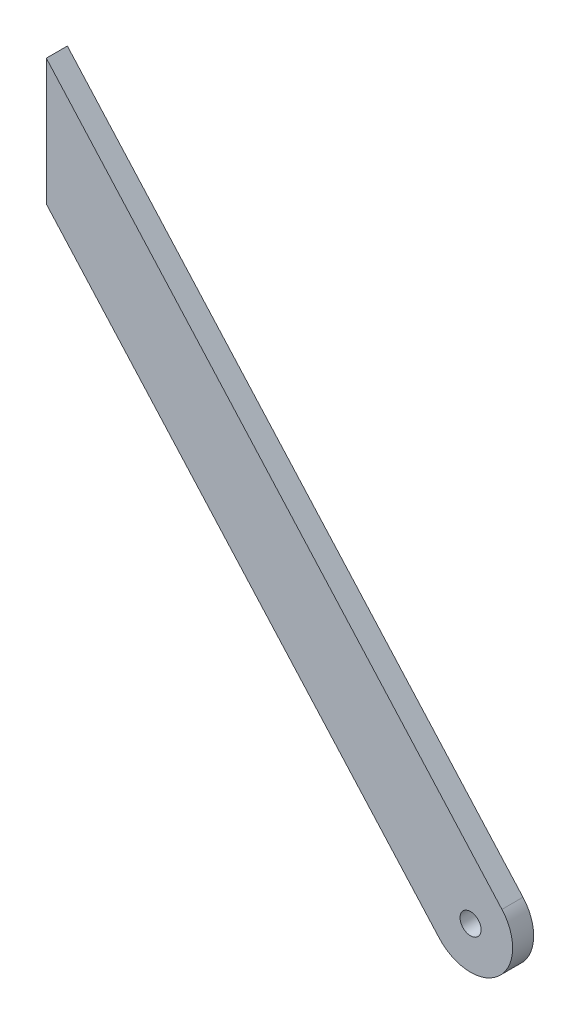
ISO-10303-21;
HEADER;
FILE_DESCRIPTION(('STEP AP214'),'2;1');
FILE_NAME('part.step','',(''),(''),'','','');
FILE_SCHEMA(('AUTOMOTIVE_DESIGN { 1 0 10303 214 1 1 1 1 }'));
ENDSEC;
DATA;
#1=APPLICATION_CONTEXT('core data for automotive mechanical design processes');
#2=APPLICATION_PROTOCOL_DEFINITION('international standard','automotive_design',2000,#1);
#3=PRODUCT_CONTEXT('',#1,'mechanical');
#4=PRODUCT('Part','Part','',(#3));
#5=PRODUCT_RELATED_PRODUCT_CATEGORY('part','',(#4));
#6=PRODUCT_DEFINITION_FORMATION('','',#4);
#7=PRODUCT_DEFINITION_CONTEXT('part definition',#1,'design');
#8=PRODUCT_DEFINITION('design','',#6,#7);
#9=PRODUCT_DEFINITION_SHAPE('','',#8);
#10=(LENGTH_UNIT() NAMED_UNIT(*) SI_UNIT(.MILLI.,.METRE.));
#11=(NAMED_UNIT(*) PLANE_ANGLE_UNIT() SI_UNIT($,.RADIAN.));
#12=(NAMED_UNIT(*) SI_UNIT($,.STERADIAN.) SOLID_ANGLE_UNIT());
#13=UNCERTAINTY_MEASURE_WITH_UNIT(LENGTH_MEASURE(1.E-05),#10,'distance_accuracy_value','');
#14=(GEOMETRIC_REPRESENTATION_CONTEXT(3) GLOBAL_UNCERTAINTY_ASSIGNED_CONTEXT((#13)) GLOBAL_UNIT_ASSIGNED_CONTEXT((#10,
#11,#12)) REPRESENTATION_CONTEXT('',''));
#15=CARTESIAN_POINT('',(0.,0.,0.));
#16=DIRECTION('',(0.,0.,1.));
#17=DIRECTION('',(1.,0.,0.));
#18=AXIS2_PLACEMENT_3D('',#15,#16,#17);
#19=CARTESIAN_POINT('',(201.573786516665,-195.366344566647,10.));
#20=DIRECTION('',(0.,0.,-1.));
#21=DIRECTION('',(-1.,0.,0.));
#22=AXIS2_PLACEMENT_3D('',#19,#20,#21);
#23=PLANE('',#22);
#24=DIRECTION('',(0.666666666666667,-0.74535599249993,0.));
#25=VECTOR('',#24,1.);
#26=CARTESIAN_POINT('',(186.666666666667,-208.69967789998,10.));
#27=LINE('',#26,#25);
#28=CARTESIAN_POINT('',(0.,0.,10.));
#29=VERTEX_POINT('',#28);
#30=CARTESIAN_POINT('',(186.666666666667,-208.69967789998,10.));
#31=VERTEX_POINT('',#30);
#32=EDGE_CURVE('E85',#29,#31,#27,.T.);
#33=ORIENTED_EDGE('',*,*,#32,.T.);
#34=CARTESIAN_POINT('',(201.573786516665,-195.366344566647,10.));
#35=DIRECTION('',(0.,0.,1.));
#36=DIRECTION('',(-1.,0.,0.));
#37=AXIS2_PLACEMENT_3D('',#34,#35,#36);
#38=CIRCLE('',#37,20.);
#39=CARTESIAN_POINT('',(216.480906366664,-182.033011233314,10.));
#40=VERTEX_POINT('',#39);
#41=EDGE_CURVE('E80',#31,#40,#38,.T.);
#42=ORIENTED_EDGE('',*,*,#41,.T.);
#43=DIRECTION('',(-0.666666666666667,0.74535599249993,0.));
#44=VECTOR('',#43,1.);
#45=CARTESIAN_POINT('',(0.,60.,10.));
#46=LINE('',#45,#44);
#47=CARTESIAN_POINT('',(0.,60.,10.));
#48=VERTEX_POINT('',#47);
#49=EDGE_CURVE('E83',#40,#48,#46,.T.);
#50=ORIENTED_EDGE('',*,*,#49,.T.);
#51=DIRECTION('',(0.,-1.,0.));
#52=VECTOR('',#51,1.);
#53=CARTESIAN_POINT('',(0.,0.,10.));
#54=LINE('',#53,#52);
#55=EDGE_CURVE('E50',#48,#29,#54,.T.);
#56=ORIENTED_EDGE('',*,*,#55,.T.);
#57=EDGE_LOOP('',(#33,#42,#50,#56));
#58=FACE_BOUND('',#57,.T.);
#59=CARTESIAN_POINT('',(201.573786516665,-195.366344566647,10.));
#60=DIRECTION('',(0.,0.,1.));
#61=DIRECTION('',(1.,0.,0.));
#62=AXIS2_PLACEMENT_3D('',#59,#60,#61);
#63=CIRCLE('',#62,4.99999999999999);
#64=CARTESIAN_POINT('',(206.573786516665,-195.366344566647,10.));
#65=VERTEX_POINT('',#64);
#66=EDGE_CURVE('E100',#65,#65,#63,.T.);
#67=ORIENTED_EDGE('',*,*,#66,.F.);
#68=EDGE_LOOP('',(#67));
#69=FACE_BOUND('',#68,.T.);
#70=ADVANCED_FACE('F33',(#58,#69),#23,.F.);
#71=CARTESIAN_POINT('',(201.573786516665,-195.366344566647,0.));
#72=DIRECTION('',(0.,0.,-1.));
#73=DIRECTION('',(-1.,0.,0.));
#74=AXIS2_PLACEMENT_3D('',#71,#72,#73);
#75=PLANE('',#74);
#76=DIRECTION('',(0.666666666666667,-0.74535599249993,0.));
#77=VECTOR('',#76,1.);
#78=CARTESIAN_POINT('',(186.666666666667,-208.69967789998,0.));
#79=LINE('',#78,#77);
#80=CARTESIAN_POINT('',(0.,0.,0.));
#81=VERTEX_POINT('',#80);
#82=CARTESIAN_POINT('',(186.666666666667,-208.69967789998,0.));
#83=VERTEX_POINT('',#82);
#84=EDGE_CURVE('E97',#81,#83,#79,.T.);
#85=ORIENTED_EDGE('',*,*,#84,.F.);
#86=DIRECTION('',(0.,-1.,0.));
#87=VECTOR('',#86,1.);
#88=CARTESIAN_POINT('',(0.,0.,0.));
#89=LINE('',#88,#87);
#90=CARTESIAN_POINT('',(0.,60.,0.));
#91=VERTEX_POINT('',#90);
#92=EDGE_CURVE('E73',#91,#81,#89,.T.);
#93=ORIENTED_EDGE('',*,*,#92,.F.);
#94=DIRECTION('',(-0.666666666666667,0.74535599249993,0.));
#95=VECTOR('',#94,1.);
#96=CARTESIAN_POINT('',(0.,60.,0.));
#97=LINE('',#96,#95);
#98=CARTESIAN_POINT('',(216.480906366664,-182.033011233314,0.));
#99=VERTEX_POINT('',#98);
#100=EDGE_CURVE('E67',#99,#91,#97,.T.);
#101=ORIENTED_EDGE('',*,*,#100,.F.);
#102=CARTESIAN_POINT('',(201.573786516665,-195.366344566647,0.));
#103=DIRECTION('',(0.,0.,1.));
#104=DIRECTION('',(-1.,0.,0.));
#105=AXIS2_PLACEMENT_3D('',#102,#103,#104);
#106=CIRCLE('',#105,20.);
#107=EDGE_CURVE('E89',#83,#99,#106,.T.);
#108=ORIENTED_EDGE('',*,*,#107,.F.);
#109=EDGE_LOOP('',(#85,#93,#101,#108));
#110=FACE_BOUND('',#109,.T.);
#111=CARTESIAN_POINT('',(201.573786516665,-195.366344566647,0.));
#112=DIRECTION('',(0.,0.,1.));
#113=DIRECTION('',(1.,0.,0.));
#114=AXIS2_PLACEMENT_3D('',#111,#112,#113);
#115=CIRCLE('',#114,4.99999999999999);
#116=CARTESIAN_POINT('',(206.573786516665,-195.366344566647,0.));
#117=VERTEX_POINT('',#116);
#118=EDGE_CURVE('E112',#117,#117,#115,.T.);
#119=ORIENTED_EDGE('',*,*,#118,.T.);
#120=EDGE_LOOP('',(#119));
#121=FACE_BOUND('',#120,.T.);
#122=ADVANCED_FACE('F108',(#110,#121),#75,.T.);
#123=CARTESIAN_POINT('',(186.666666666667,-208.69967789998,10.));
#124=DIRECTION('',(0.74535599249993,0.666666666666667,0.));
#125=DIRECTION('',(-0.666666666666667,0.74535599249993,0.));
#126=AXIS2_PLACEMENT_3D('',#123,#124,#125);
#127=PLANE('',#126);
#128=ORIENTED_EDGE('',*,*,#84,.T.);
#129=DIRECTION('',(0.,0.,-1.));
#130=VECTOR('',#129,1.);
#131=CARTESIAN_POINT('',(186.666666666667,-208.69967789998,10.));
#132=LINE('',#131,#130);
#133=EDGE_CURVE('E11',#31,#83,#132,.T.);
#134=ORIENTED_EDGE('',*,*,#133,.F.);
#135=ORIENTED_EDGE('',*,*,#32,.F.);
#136=DIRECTION('',(0.,0.,-1.));
#137=VECTOR('',#136,1.);
#138=CARTESIAN_POINT('',(0.,0.,10.));
#139=LINE('',#138,#137);
#140=EDGE_CURVE('E93',#29,#81,#139,.T.);
#141=ORIENTED_EDGE('',*,*,#140,.T.);
#142=EDGE_LOOP('',(#128,#134,#135,#141));
#143=FACE_BOUND('',#142,.T.);
#144=ADVANCED_FACE('F35',(#143),#127,.F.);
#145=CARTESIAN_POINT('',(201.573786516665,-195.366344566647,10.));
#146=DIRECTION('',(0.,0.,-1.));
#147=DIRECTION('',(-1.,0.,0.));
#148=AXIS2_PLACEMENT_3D('',#145,#146,#147);
#149=CYLINDRICAL_SURFACE('',#148,20.);
#150=ORIENTED_EDGE('',*,*,#107,.T.);
#151=DIRECTION('',(0.,0.,-1.));
#152=VECTOR('',#151,1.);
#153=CARTESIAN_POINT('',(216.480906366664,-182.033011233314,10.));
#154=LINE('',#153,#152);
#155=EDGE_CURVE('E42',#40,#99,#154,.T.);
#156=ORIENTED_EDGE('',*,*,#155,.F.);
#157=ORIENTED_EDGE('',*,*,#41,.F.);
#158=ORIENTED_EDGE('',*,*,#133,.T.);
#159=EDGE_LOOP('',(#150,#156,#157,#158));
#160=FACE_BOUND('',#159,.T.);
#161=ADVANCED_FACE('F88',(#160),#149,.T.);
#162=CARTESIAN_POINT('',(0.,60.,10.));
#163=DIRECTION('',(-0.74535599249993,-0.666666666666667,0.));
#164=DIRECTION('',(0.666666666666667,-0.74535599249993,0.));
#165=AXIS2_PLACEMENT_3D('',#162,#163,#164);
#166=PLANE('',#165);
#167=ORIENTED_EDGE('',*,*,#100,.T.);
#168=DIRECTION('',(0.,0.,-1.));
#169=VECTOR('',#168,1.);
#170=CARTESIAN_POINT('',(0.,60.,10.));
#171=LINE('',#170,#169);
#172=EDGE_CURVE('E90',#48,#91,#171,.T.);
#173=ORIENTED_EDGE('',*,*,#172,.F.);
#174=ORIENTED_EDGE('',*,*,#49,.F.);
#175=ORIENTED_EDGE('',*,*,#155,.T.);
#176=EDGE_LOOP('',(#167,#173,#174,#175));
#177=FACE_BOUND('',#176,.T.);
#178=ADVANCED_FACE('F91',(#177),#166,.F.);
#179=CARTESIAN_POINT('',(0.,0.,10.));
#180=DIRECTION('',(1.,0.,0.));
#181=DIRECTION('',(0.,0.,-1.));
#182=AXIS2_PLACEMENT_3D('',#179,#180,#181);
#183=PLANE('',#182);
#184=ORIENTED_EDGE('',*,*,#92,.T.);
#185=ORIENTED_EDGE('',*,*,#140,.F.);
#186=ORIENTED_EDGE('',*,*,#55,.F.);
#187=ORIENTED_EDGE('',*,*,#172,.T.);
#188=EDGE_LOOP('',(#184,#185,#186,#187));
#189=FACE_BOUND('',#188,.T.);
#190=ADVANCED_FACE('F105',(#189),#183,.F.);
#191=CARTESIAN_POINT('',(201.573786516665,-195.366344566647,10.));
#192=DIRECTION('',(0.,0.,-1.));
#193=DIRECTION('',(-1.,0.,0.));
#194=AXIS2_PLACEMENT_3D('',#191,#192,#193);
#195=CYLINDRICAL_SURFACE('',#194,4.99999999999999);
#196=ORIENTED_EDGE('',*,*,#66,.T.);
#197=EDGE_LOOP('',(#196));
#198=FACE_BOUND('',#197,.T.);
#199=ORIENTED_EDGE('',*,*,#118,.F.);
#200=EDGE_LOOP('',(#199));
#201=FACE_BOUND('',#200,.T.);
#202=ADVANCED_FACE('F118',(#198,#201),#195,.F.);
#203=CLOSED_SHELL('',(#70,#122,#144,#161,#178,#190,#202));
#204=MANIFOLD_SOLID_BREP('B2',#203);
#205=ADVANCED_BREP_SHAPE_REPRESENTATION('',(#18,#204),#14);
#206=SHAPE_DEFINITION_REPRESENTATION(#9,#205);
ENDSEC;
END-ISO-10303-21;
